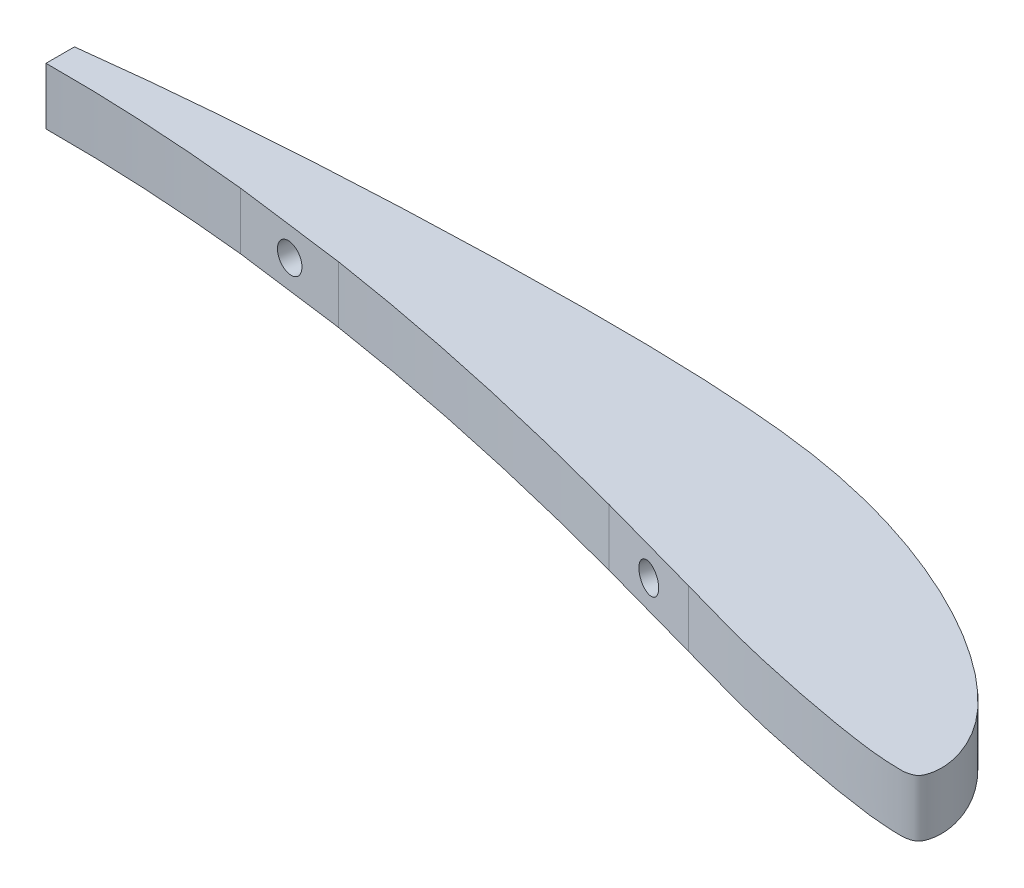
ISO-10303-21;
HEADER;
FILE_DESCRIPTION(('STEP AP214'),'2;1');
FILE_NAME('part.step','',(''),(''),'','','');
FILE_SCHEMA(('AUTOMOTIVE_DESIGN { 1 0 10303 214 1 1 1 1 }'));
ENDSEC;
DATA;
#1=APPLICATION_CONTEXT('core data for automotive mechanical design processes');
#2=APPLICATION_PROTOCOL_DEFINITION('international standard','automotive_design',2000,#1);
#3=PRODUCT_CONTEXT('',#1,'mechanical');
#4=PRODUCT('Part','Part','',(#3));
#5=PRODUCT_RELATED_PRODUCT_CATEGORY('part','',(#4));
#6=PRODUCT_DEFINITION_FORMATION('','',#4);
#7=PRODUCT_DEFINITION_CONTEXT('part definition',#1,'design');
#8=PRODUCT_DEFINITION('design','',#6,#7);
#9=PRODUCT_DEFINITION_SHAPE('','',#8);
#10=(LENGTH_UNIT() NAMED_UNIT(*) SI_UNIT(.MILLI.,.METRE.));
#11=(NAMED_UNIT(*) PLANE_ANGLE_UNIT() SI_UNIT($,.RADIAN.));
#12=(NAMED_UNIT(*) SI_UNIT($,.STERADIAN.) SOLID_ANGLE_UNIT());
#13=UNCERTAINTY_MEASURE_WITH_UNIT(LENGTH_MEASURE(1.E-05),#10,'distance_accuracy_value','');
#14=(GEOMETRIC_REPRESENTATION_CONTEXT(3) GLOBAL_UNCERTAINTY_ASSIGNED_CONTEXT((#13)) GLOBAL_UNIT_ASSIGNED_CONTEXT((#10,
#11,#12)) REPRESENTATION_CONTEXT('',''));
#15=CARTESIAN_POINT('',(0.,0.,0.));
#16=DIRECTION('',(0.,0.,1.));
#17=DIRECTION('',(1.,0.,0.));
#18=AXIS2_PLACEMENT_3D('',#15,#16,#17);
#19=CARTESIAN_POINT('',(-745.964774994291,6.35,0.));
#20=DIRECTION('',(-1.,0.,0.));
#21=DIRECTION('',(0.,0.,1.));
#22=AXIS2_PLACEMENT_3D('',#19,#20,#21);
#23=PLANE('',#22);
#24=DIRECTION('',(0.,0.,-1.));
#25=VECTOR('',#24,1.);
#26=CARTESIAN_POINT('',(-745.964774994291,-6.35,0.));
#27=LINE('',#26,#25);
#28=CARTESIAN_POINT('',(-745.964774994291,-6.35,894.328945770832));
#29=VERTEX_POINT('',#28);
#30=CARTESIAN_POINT('',(-745.964774994291,-6.35,887.978945770832));
#31=VERTEX_POINT('',#30);
#32=EDGE_CURVE('E279',#29,#31,#27,.T.);
#33=ORIENTED_EDGE('',*,*,#32,.F.);
#34=DIRECTION('',(0.,-1.,0.));
#35=VECTOR('',#34,1.);
#36=CARTESIAN_POINT('',(-745.964774994291,6.35,894.328945770832));
#37=LINE('',#36,#35);
#38=CARTESIAN_POINT('',(-745.964774994291,6.35,894.328945770832));
#39=VERTEX_POINT('',#38);
#40=EDGE_CURVE('E11',#39,#29,#37,.T.);
#41=ORIENTED_EDGE('',*,*,#40,.F.);
#42=DIRECTION('',(0.,0.,-1.));
#43=VECTOR('',#42,1.);
#44=CARTESIAN_POINT('',(-745.964774994291,6.35,0.));
#45=LINE('',#44,#43);
#46=CARTESIAN_POINT('',(-745.964774994291,6.35,887.978945770832));
#47=VERTEX_POINT('',#46);
#48=EDGE_CURVE('E140',#39,#47,#45,.T.);
#49=ORIENTED_EDGE('',*,*,#48,.T.);
#50=DIRECTION('',(0.,-1.,0.));
#51=VECTOR('',#50,1.);
#52=CARTESIAN_POINT('',(-745.964774994291,6.35,887.978945770832));
#53=LINE('',#52,#51);
#54=EDGE_CURVE('E91',#47,#31,#53,.T.);
#55=ORIENTED_EDGE('',*,*,#54,.T.);
#56=EDGE_LOOP('',(#33,#41,#49,#55));
#57=FACE_BOUND('',#56,.T.);
#58=ADVANCED_FACE('F41',(#57),#23,.T.);
#59=CARTESIAN_POINT('',(-808.699340930954,6.35,905.288276438396));
#60=CARTESIAN_POINT('',(-808.698191857178,6.35,905.296198372319));
#61=CARTESIAN_POINT('',(-807.475168535791,6.35,904.612954842182));
#62=CARTESIAN_POINT('',(-806.127033424416,6.35,903.950113964455));
#63=CARTESIAN_POINT('',(-802.618982801805,6.35,902.239395629105));
#64=CARTESIAN_POINT('',(-797.908770633153,6.35,900.469078718772));
#65=CARTESIAN_POINT('',(-791.365223913977,6.35,898.656269746206));
#66=CARTESIAN_POINT('',(-783.428383357225,6.35,897.115111010994));
#67=CARTESIAN_POINT('',(-774.188924733392,6.35,895.833621875964));
#68=CARTESIAN_POINT('',(-763.822767503538,6.35,894.900147269464));
#69=CARTESIAN_POINT('',(-752.454908031272,6.35,894.365311487662));
#70=CARTESIAN_POINT('',(-740.235462609927,6.35,894.260295970912));
#71=CARTESIAN_POINT('',(-727.312590057803,6.35,894.617094053665));
#72=CARTESIAN_POINT('',(-713.841744494242,6.35,895.432085538653));
#73=CARTESIAN_POINT('',(-699.977546281879,6.35,896.700198024576));
#74=CARTESIAN_POINT('',(-685.874377769709,6.35,898.403904226764));
#75=CARTESIAN_POINT('',(-671.683433076153,6.35,900.5040600539));
#76=CARTESIAN_POINT('',(-657.55079679191,6.35,902.953772352294));
#77=CARTESIAN_POINT('',(-643.616607747686,6.35,905.709113801342));
#78=CARTESIAN_POINT('',(-630.007767989694,6.35,908.689841220301));
#79=CARTESIAN_POINT('',(-616.843534103814,6.35,911.833301283403));
#80=CARTESIAN_POINT('',(-604.23250930294,6.35,915.056798443748));
#81=CARTESIAN_POINT('',(-592.267820656821,6.35,918.281273148751));
#82=CARTESIAN_POINT('',(-581.031641475759,6.35,921.417682371066));
#83=CARTESIAN_POINT('',(-570.587974662916,6.35,924.370907439865));
#84=CARTESIAN_POINT('',(-560.984262009927,6.35,927.085132383365));
#85=CARTESIAN_POINT('',(-552.153134358304,6.35,929.351793485921));
#86=CARTESIAN_POINT('',(-544.047010511215,6.35,931.129332229515));
#87=CARTESIAN_POINT('',(-536.686335580171,6.35,932.606040356279));
#88=CARTESIAN_POINT('',(-530.108904544209,6.35,933.796548076851));
#89=CARTESIAN_POINT('',(-524.381359639331,6.35,934.681063632716));
#90=CARTESIAN_POINT('',(-519.572677977109,6.35,935.309823737263));
#91=CARTESIAN_POINT('',(-515.722704658943,6.35,935.509297913111));
#92=CARTESIAN_POINT('',(-512.904850762729,6.35,935.614509438357));
#93=CARTESIAN_POINT('',(-510.731548466341,6.35,934.80357871422));
#94=CARTESIAN_POINT('',(-509.995877917624,6.35,932.852574872877));
#95=CARTESIAN_POINT('',(-509.710588794092,6.35,930.680317225795));
#96=CARTESIAN_POINT('',(-509.979483139819,6.35,928.059090990653));
#97=CARTESIAN_POINT('',(-510.771882292447,6.35,925.175527305722));
#98=CARTESIAN_POINT('',(-512.131708870413,6.35,922.092676733402));
#99=CARTESIAN_POINT('',(-514.05615703889,6.35,918.877948489114));
#100=CARTESIAN_POINT('',(-516.642060662247,6.35,915.616901185906));
#101=CARTESIAN_POINT('',(-519.878140770943,6.35,912.33680698191));
#102=CARTESIAN_POINT('',(-523.71087800143,6.35,909.00960317164));
#103=CARTESIAN_POINT('',(-528.144071181997,6.35,905.698403477286));
#104=CARTESIAN_POINT('',(-533.151760778689,6.35,902.445104766043));
#105=CARTESIAN_POINT('',(-538.708148379875,6.35,899.283988977106));
#106=CARTESIAN_POINT('',(-544.799372854643,6.35,896.270613220281));
#107=CARTESIAN_POINT('',(-551.387398728674,6.35,893.42159270246));
#108=CARTESIAN_POINT('',(-558.447971928289,6.35,890.792240248777));
#109=CARTESIAN_POINT('',(-565.953566419515,6.35,888.420626997395));
#110=CARTESIAN_POINT('',(-573.904555797038,6.35,886.40196354502));
#111=CARTESIAN_POINT('',(-582.302577431605,6.35,884.732531082563));
#112=CARTESIAN_POINT('',(-591.189649692332,6.35,883.495409148244));
#113=CARTESIAN_POINT('',(-600.56600959241,6.35,882.653332524039));
#114=CARTESIAN_POINT('',(-610.398787900595,6.35,882.031392964846));
#115=CARTESIAN_POINT('',(-620.641966712539,6.35,881.682741386434));
#116=CARTESIAN_POINT('',(-631.233440040302,6.35,881.550564488751));
#117=CARTESIAN_POINT('',(-642.10944098066,6.35,881.598155150758));
#118=CARTESIAN_POINT('',(-653.189236878864,6.35,881.776525136796));
#119=CARTESIAN_POINT('',(-664.381516727969,6.35,882.072222380966));
#120=CARTESIAN_POINT('',(-675.591761469604,6.35,882.461412521099));
#121=CARTESIAN_POINT('',(-686.732134704751,6.35,882.961422294552));
#122=CARTESIAN_POINT('',(-697.722460944845,6.35,883.574531849831));
#123=CARTESIAN_POINT('',(-708.49209940602,6.35,884.294448937404));
#124=CARTESIAN_POINT('',(-718.972610172344,6.35,885.130375886253));
#125=CARTESIAN_POINT('',(-729.102517035557,6.35,886.065145308932));
#126=CARTESIAN_POINT('',(-738.818795329112,6.35,887.101652587971));
#127=CARTESIAN_POINT('',(-748.063605468283,6.35,888.221764068848));
#128=CARTESIAN_POINT('',(-756.780655187676,6.35,889.420485483526));
#129=CARTESIAN_POINT('',(-764.917940325975,6.35,890.690116784721));
#130=CARTESIAN_POINT('',(-772.428550034332,6.35,892.020421944594));
#131=CARTESIAN_POINT('',(-779.27038565612,6.35,893.396845324595));
#132=CARTESIAN_POINT('',(-785.405289419975,6.35,894.813453468347));
#133=CARTESIAN_POINT('',(-790.800823784972,6.35,896.256131848235));
#134=CARTESIAN_POINT('',(-795.431420104736,6.35,897.713595662658));
#135=CARTESIAN_POINT('',(-799.288024283011,6.35,899.160721449419));
#136=CARTESIAN_POINT('',(-802.424531012396,6.35,900.727430700965));
#137=CARTESIAN_POINT('',(-804.758963598242,6.35,902.349229215227));
#138=CARTESIAN_POINT('',(-806.752273021045,6.35,903.891274172012));
#139=CARTESIAN_POINT('',(-807.654210805784,6.35,904.634120713898));
#140=CARTESIAN_POINT('',(-808.700467109619,6.35,905.280512347734));
#141=CARTESIAN_POINT('',(-808.699340930954,6.35,905.288276438396));
#142=B_SPLINE_CURVE_WITH_KNOTS('',3,(#59,#60,#61,#62,#63,#64,#65,#66,#67,#68,#69,#70,#71,#72,
#73,#74,#75,#76,#77,#78,#79,#80,#81,#82,#83,#84,#85,#86,#87,#88,#89,#90,#91,#92,#93,#94,#95,#96,
#97,#98,#99,#100,#101,#102,#103,#104,#105,#106,#107,#108,#109,#110,#111,#112,#113,#114,#115,
#116,#117,#118,#119,#120,#121,#122,#123,#124,#125,#126,#127,#128,#129,#130,#131,#132,#133,#134,
#135,#136,#137,#138,#139,#140,#141),.UNSPECIFIED.,.T.,.F.,(4,1,1,1,1,1,1,1,1,1,1,1,1,1,1,1,1,1,
1,1,1,1,1,1,1,1,1,1,1,1,1,1,1,1,1,1,1,1,1,1,1,1,1,1,1,1,1,1,1,1,1,1,1,1,1,1,1,1,1,1,1,1,1,1,1,1,
1,1,1,1,1,1,1,1,1,1,1,1,1,1,4),(0.,0.000999594313299212,0.00414743475003776,0.00974820897402395,
0.0180443769200241,0.0288641783652488,0.0418307896412056,0.0567138069576779,0.0733412324180671,
0.0915079886594422,0.111021837040934,0.131661709492213,0.153207715119588,0.175433402170293,
0.198110317315045,0.221011446315139,0.243905882495844,0.266573311035611,0.288810349135398,
0.310405035997316,0.331177743204304,0.350943876391454,0.369556399670184,0.386864963345299,
0.402753039208367,0.417195875784384,0.430379518903367,0.442362633174289,0.453032155511853,
0.462284345612072,0.470026206002306,0.476176644820514,0.480649947409099,0.483553073373249,
0.486420689318958,0.489953231463337,0.494096926743959,0.498850588304447,0.504196750280792,
0.510125492183598,0.516691031253851,0.524011699263473,0.532092122465354,0.540897920896839,
0.550403413935838,0.56058104089174,0.571396483088815,0.582828080950064,0.594829641292505,
0.607347037120814,0.620384325080165,0.633968936607918,0.648199967415963,0.663193936825189,
0.678898580785939,0.695226562400326,0.712113220733955,0.729459406270428,0.747143116877991,
0.765009771536014,0.782904928287736,0.800688045055655,0.818242104849469,0.835449083117584,
0.852211620697039,0.868429578359411,0.884009362888173,0.898854951230209,0.912881826809319,
0.926010749515415,0.938166770937821,0.949289699209522,0.959322171916738,0.968216949447241,
0.975948220006129,0.982474409223121,0.987904722814407,0.992516501480522,0.996351137832237,
0.999020322442866,1.),.UNSPECIFIED.);
#143=DIRECTION('',(0.,-1.,0.));
#144=VECTOR('',#143,1.);
#145=SURFACE_OF_LINEAR_EXTRUSION('',#142,#144);
#146=CARTESIAN_POINT('',(-745.964774994291,-6.35,894.328945770832));
#147=CARTESIAN_POINT('',(-744.133904200339,-6.35,894.315721527457));
#148=CARTESIAN_POINT('',(-737.978827427177,-6.35,894.32260124425));
#149=CARTESIAN_POINT('',(-727.312590057803,-6.35,894.617094053665));
#150=CARTESIAN_POINT('',(-713.845005557512,-6.35,895.431888243036));
#151=CARTESIAN_POINT('',(-704.715487742827,-6.35,896.266834180997));
#152=CARTESIAN_POINT('',(-700.088539907113,-6.35,896.757033353814));
#153=B_SPLINE_CURVE_WITH_KNOTS('',3,(#146,#147,#148,#149,#150,#151,#152),.UNSPECIFIED.,.F.,.F.,
(4,1,1,1,4),(0.102282201044065,0.111021837040934,0.131661709492213,0.153207715119588,
0.175417809222681),.UNSPECIFIED.);
#154=CARTESIAN_POINT('',(-700.088539907113,-6.35,896.757033353814));
#155=VERTEX_POINT('',#154);
#156=EDGE_CURVE('E242',#29,#155,#153,.T.);
#157=ORIENTED_EDGE('',*,*,#156,.T.);
#158=DIRECTION('',(0.,-1.,0.));
#159=VECTOR('',#158,1.);
#160=CARTESIAN_POINT('',(-700.088539907113,6.35,896.757033353814));
#161=LINE('',#160,#159);
#162=CARTESIAN_POINT('',(-700.088539907113,6.35,896.757033353814));
#163=VERTEX_POINT('',#162);
#164=EDGE_CURVE('E52',#163,#155,#161,.T.);
#165=ORIENTED_EDGE('',*,*,#164,.F.);
#166=CARTESIAN_POINT('',(-700.088539907113,6.35,896.757033353814));
#167=CARTESIAN_POINT('',(-704.715487742827,6.35,896.266834180997));
#168=CARTESIAN_POINT('',(-713.845005557512,6.35,895.431888243036));
#169=CARTESIAN_POINT('',(-727.312590057803,6.35,894.617094053665));
#170=CARTESIAN_POINT('',(-737.978827427177,6.35,894.32260124425));
#171=CARTESIAN_POINT('',(-744.133904200339,6.35,894.315721527457));
#172=CARTESIAN_POINT('',(-745.964774994291,6.35,894.328945770832));
#173=B_SPLINE_CURVE_WITH_KNOTS('',3,(#166,#167,#168,#169,#170,#171,#172),.UNSPECIFIED.,.F.,.F.,
(4,1,1,1,4),(0.102282201044065,0.124492295147158,0.146038300774533,0.166678173225812,
0.175417809222681),.UNSPECIFIED.);
#174=EDGE_CURVE('E142',#39,#163,#173,.F.);
#175=ORIENTED_EDGE('',*,*,#174,.F.);
#176=ORIENTED_EDGE('',*,*,#40,.T.);
#177=EDGE_LOOP('',(#157,#165,#175,#176));
#178=FACE_BOUND('',#177,.T.);
#179=ADVANCED_FACE('F163',(#178),#145,.F.);
#180=CARTESIAN_POINT('',(-127.295549227988,6.35,971.78781403398));
#181=DIRECTION('',(-0.129881536724028,0.,0.991529518682225));
#182=DIRECTION('',(0.991529518682225,0.,0.129881536724028));
#183=AXIS2_PLACEMENT_3D('',#180,#181,#182);
#184=PLANE('',#183);
#185=CARTESIAN_POINT('',(-687.496115019849,0.,898.40652887021));
#186=DIRECTION('',(-0.129881536724028,0.,0.991529518682225));
#187=DIRECTION('',(0.991529518682225,0.,0.129881536724028));
#188=AXIS2_PLACEMENT_3D('',#185,#186,#187);
#189=CIRCLE('',#188,3.17499999999999);
#190=CARTESIAN_POINT('',(-684.348008798032,0.,898.818902749308));
#191=VERTEX_POINT('',#190);
#192=EDGE_CURVE('E282',#191,#191,#189,.T.);
#193=ORIENTED_EDGE('',*,*,#192,.F.);
#194=EDGE_LOOP('',(#193));
#195=FACE_BOUND('',#194,.T.);
#196=DIRECTION('',(-0.991529518682225,0.,-0.129881536724028));
#197=VECTOR('',#196,1.);
#198=CARTESIAN_POINT('',(-127.295549227988,-6.35,971.78781403398));
#199=LINE('',#198,#197);
#200=CARTESIAN_POINT('',(-674.903690132584,-6.35,900.056024386604));
#201=VERTEX_POINT('',#200);
#202=EDGE_CURVE('E235',#201,#155,#199,.T.);
#203=ORIENTED_EDGE('',*,*,#202,.F.);
#204=DIRECTION('',(0.,-1.,0.));
#205=VECTOR('',#204,1.);
#206=CARTESIAN_POINT('',(-674.903690132584,6.35,900.056024386604));
#207=LINE('',#206,#205);
#208=CARTESIAN_POINT('',(-674.903690132584,6.35,900.056024386604));
#209=VERTEX_POINT('',#208);
#210=EDGE_CURVE('E127',#209,#201,#207,.T.);
#211=ORIENTED_EDGE('',*,*,#210,.F.);
#212=DIRECTION('',(-0.991529518682225,0.,-0.129881536724028));
#213=VECTOR('',#212,1.);
#214=CARTESIAN_POINT('',(-127.295549227988,6.35,971.78781403398));
#215=LINE('',#214,#213);
#216=EDGE_CURVE('E113',#209,#163,#215,.T.);
#217=ORIENTED_EDGE('',*,*,#216,.T.);
#218=ORIENTED_EDGE('',*,*,#164,.T.);
#219=EDGE_LOOP('',(#203,#211,#217,#218));
#220=FACE_BOUND('',#219,.T.);
#221=ADVANCED_FACE('F316',(#195,#220),#184,.T.);
#222=CARTESIAN_POINT('',(-674.903690132584,-6.35,900.056024386604));
#223=CARTESIAN_POINT('',(-673.832475338733,-6.35,900.221916955802));
#224=CARTESIAN_POINT('',(-668.024145960953,-6.35,901.138350816725));
#225=CARTESIAN_POINT('',(-657.55079679191,-6.35,902.953772352294));
#226=CARTESIAN_POINT('',(-643.616607747686,-6.35,905.709113801342));
#227=CARTESIAN_POINT('',(-630.007767989694,-6.35,908.689841220301));
#228=CARTESIAN_POINT('',(-616.843534103814,-6.35,911.833301283403));
#229=CARTESIAN_POINT('',(-606.152562090681,-6.35,914.566014799538));
#230=CARTESIAN_POINT('',(-599.861126075847,-6.35,916.241106363395));
#231=CARTESIAN_POINT('',(-597.776391121279,-6.35,916.80250156136));
#232=B_SPLINE_CURVE_WITH_KNOTS('',3,(#222,#223,#224,#225,#226,#227,#228,#229,#230,#231),
.UNSPECIFIED.,.F.,.F.,(4,1,1,1,1,1,1,4),(0.215837070183439,0.221011446315139,0.243905882495844,
0.266573311035611,0.288810349135398,0.310405035997316,0.331177743204304,0.3414839273307),.UNSPECIFIED.);
#233=CARTESIAN_POINT('',(-597.776391121279,-6.35,916.80250156136));
#234=VERTEX_POINT('',#233);
#235=EDGE_CURVE('E122',#201,#234,#232,.T.);
#236=ORIENTED_EDGE('',*,*,#235,.T.);
#237=DIRECTION('',(0.,-1.,0.));
#238=VECTOR('',#237,1.);
#239=CARTESIAN_POINT('',(-597.776391121279,6.35,916.80250156136));
#240=LINE('',#239,#238);
#241=CARTESIAN_POINT('',(-597.776391121279,6.35,916.80250156136));
#242=VERTEX_POINT('',#241);
#243=EDGE_CURVE('E119',#242,#234,#240,.T.);
#244=ORIENTED_EDGE('',*,*,#243,.F.);
#245=CARTESIAN_POINT('',(-597.776391121279,6.35,916.80250156136));
#246=CARTESIAN_POINT('',(-599.861126075847,6.35,916.241106363395));
#247=CARTESIAN_POINT('',(-606.152562090681,6.35,914.566014799538));
#248=CARTESIAN_POINT('',(-616.843534103814,6.35,911.833301283403));
#249=CARTESIAN_POINT('',(-630.007767989694,6.35,908.689841220301));
#250=CARTESIAN_POINT('',(-643.616607747686,6.35,905.709113801342));
#251=CARTESIAN_POINT('',(-657.55079679191,6.35,902.953772352294));
#252=CARTESIAN_POINT('',(-668.024145960953,6.35,901.138350816725));
#253=CARTESIAN_POINT('',(-673.832475338733,6.35,900.221916955802));
#254=CARTESIAN_POINT('',(-674.903690132584,6.35,900.056024386604));
#255=B_SPLINE_CURVE_WITH_KNOTS('',3,(#245,#246,#247,#248,#249,#250,#251,#252,#253,#254),
.UNSPECIFIED.,.F.,.F.,(4,1,1,1,1,1,1,4),(0.215837070183439,0.226143254309835,0.246915961516823,
0.268510648378741,0.290747686478528,0.313415115018295,0.336309551199,0.3414839273307),.UNSPECIFIED.);
#256=EDGE_CURVE('E106',#209,#242,#255,.F.);
#257=ORIENTED_EDGE('',*,*,#256,.F.);
#258=ORIENTED_EDGE('',*,*,#210,.T.);
#259=EDGE_LOOP('',(#236,#244,#257,#258));
#260=FACE_BOUND('',#259,.T.);
#261=ADVANCED_FACE('F120',(#260),#145,.F.);
#262=CARTESIAN_POINT('',(-279.350563823569,6.35,1005.28710825817));
#263=DIRECTION('',(-0.267736527501418,0.,0.963492164909234));
#264=DIRECTION('',(0.963492164909234,0.,0.267736527501418));
#265=AXIS2_PLACEMENT_3D('',#262,#263,#264);
#266=PLANE('',#265);
#267=CARTESIAN_POINT('',(-585.540040626931,0.,920.202755460628));
#268=DIRECTION('',(-0.267736527501418,0.,0.963492164909234));
#269=DIRECTION('',(0.963492164909234,0.,0.267736527501418));
#270=AXIS2_PLACEMENT_3D('',#267,#268,#269);
#271=CIRCLE('',#270,3.17499999999999);
#272=CARTESIAN_POINT('',(-582.480953003345,0.,921.052818935445));
#273=VERTEX_POINT('',#272);
#274=EDGE_CURVE('E302',#273,#273,#271,.T.);
#275=ORIENTED_EDGE('',*,*,#274,.F.);
#276=EDGE_LOOP('',(#275));
#277=FACE_BOUND('',#276,.T.);
#278=DIRECTION('',(-0.963492164909234,0.,-0.267736527501418));
#279=VECTOR('',#278,1.);
#280=CARTESIAN_POINT('',(-279.350563823569,-6.35,1005.28710825817));
#281=LINE('',#280,#279);
#282=CARTESIAN_POINT('',(-573.303690132584,-6.35,923.603009359896));
#283=VERTEX_POINT('',#282);
#284=EDGE_CURVE('E287',#283,#234,#281,.T.);
#285=ORIENTED_EDGE('',*,*,#284,.F.);
#286=DIRECTION('',(0.,-1.,0.));
#287=VECTOR('',#286,1.);
#288=CARTESIAN_POINT('',(-573.303690132584,6.35,923.603009359896));
#289=LINE('',#288,#287);
#290=CARTESIAN_POINT('',(-573.303690132584,6.35,923.603009359896));
#291=VERTEX_POINT('',#290);
#292=EDGE_CURVE('E84',#291,#283,#289,.T.);
#293=ORIENTED_EDGE('',*,*,#292,.F.);
#294=DIRECTION('',(-0.963492164909234,0.,-0.267736527501418));
#295=VECTOR('',#294,1.);
#296=CARTESIAN_POINT('',(-279.350563823569,6.35,1005.28710825817));
#297=LINE('',#296,#295);
#298=EDGE_CURVE('E111',#291,#242,#297,.T.);
#299=ORIENTED_EDGE('',*,*,#298,.T.);
#300=ORIENTED_EDGE('',*,*,#243,.T.);
#301=EDGE_LOOP('',(#285,#293,#299,#300));
#302=FACE_BOUND('',#301,.T.);
#303=ADVANCED_FACE('F129',(#277,#302),#266,.T.);
#304=CARTESIAN_POINT('',(-573.303690132584,-6.35,923.603009359896));
#305=CARTESIAN_POINT('',(-572.302950395517,-6.35,923.885809681457));
#306=CARTESIAN_POINT('',(-568.099460895047,-6.35,925.07421733522));
#307=CARTESIAN_POINT('',(-560.984262009927,-6.35,927.085132383365));
#308=CARTESIAN_POINT('',(-552.153134358304,-6.35,929.351793485921));
#309=CARTESIAN_POINT('',(-544.047010511215,-6.35,931.129332229515));
#310=CARTESIAN_POINT('',(-536.686335580171,-6.35,932.606040356279));
#311=CARTESIAN_POINT('',(-530.108904544209,-6.35,933.796548076851));
#312=CARTESIAN_POINT('',(-524.381359639331,-6.35,934.681063632716));
#313=CARTESIAN_POINT('',(-519.572677977109,-6.35,935.309823737263));
#314=CARTESIAN_POINT('',(-515.722704658943,-6.35,935.509297913111));
#315=CARTESIAN_POINT('',(-512.904850762729,-6.35,935.614509438357));
#316=CARTESIAN_POINT('',(-510.731548466341,-6.35,934.80357871422));
#317=CARTESIAN_POINT('',(-509.995877917624,-6.35,932.852574872877));
#318=CARTESIAN_POINT('',(-509.710588794092,-6.35,930.680317225795));
#319=CARTESIAN_POINT('',(-509.979483139819,-6.35,928.059090990653));
#320=CARTESIAN_POINT('',(-510.771882292447,-6.35,925.175527305722));
#321=CARTESIAN_POINT('',(-512.131708870413,-6.35,922.092676733402));
#322=CARTESIAN_POINT('',(-514.05615703889,-6.35,918.877948489114));
#323=CARTESIAN_POINT('',(-516.642060662247,-6.35,915.616901185906));
#324=CARTESIAN_POINT('',(-519.878140770943,-6.35,912.33680698191));
#325=CARTESIAN_POINT('',(-523.71087800143,-6.35,909.00960317164));
#326=CARTESIAN_POINT('',(-528.144071181997,-6.35,905.698403477286));
#327=CARTESIAN_POINT('',(-533.151760778689,-6.35,902.445104766043));
#328=CARTESIAN_POINT('',(-538.708148379875,-6.35,899.283988977106));
#329=CARTESIAN_POINT('',(-544.799372854643,-6.35,896.270613220281));
#330=CARTESIAN_POINT('',(-551.387398728674,-6.35,893.42159270246));
#331=CARTESIAN_POINT('',(-558.447971928289,-6.35,890.792240248777));
#332=CARTESIAN_POINT('',(-565.953566419515,-6.35,888.420626997395));
#333=CARTESIAN_POINT('',(-573.904555797038,-6.35,886.40196354502));
#334=CARTESIAN_POINT('',(-582.302577431605,-6.35,884.732531082563));
#335=CARTESIAN_POINT('',(-591.189649692332,-6.35,883.495409148244));
#336=CARTESIAN_POINT('',(-600.56600959241,-6.35,882.653332524039));
#337=CARTESIAN_POINT('',(-610.398787900595,-6.35,882.031392964846));
#338=CARTESIAN_POINT('',(-620.641966712539,-6.35,881.682741386434));
#339=CARTESIAN_POINT('',(-631.233440040302,-6.35,881.550564488751));
#340=CARTESIAN_POINT('',(-642.10944098066,-6.35,881.598155150758));
#341=CARTESIAN_POINT('',(-653.189236878864,-6.35,881.776525136796));
#342=CARTESIAN_POINT('',(-664.381516727969,-6.35,882.072222380966));
#343=CARTESIAN_POINT('',(-675.591761469604,-6.35,882.461412521099));
#344=CARTESIAN_POINT('',(-686.732134704751,-6.35,882.961422294552));
#345=CARTESIAN_POINT('',(-697.722460944845,-6.35,883.574531849831));
#346=CARTESIAN_POINT('',(-708.49209940602,-6.35,884.294448937404));
#347=CARTESIAN_POINT('',(-718.972610172344,-6.35,885.130375886253));
#348=CARTESIAN_POINT('',(-729.102517035557,-6.35,886.065145308932));
#349=CARTESIAN_POINT('',(-738.061681725226,-6.35,887.020885679307));
#350=CARTESIAN_POINT('',(-743.634498034994,-6.35,887.686438438243));
#351=CARTESIAN_POINT('',(-745.964774994291,-6.35,887.978945770832));
#352=B_SPLINE_CURVE_WITH_KNOTS('',3,(#304,#305,#306,#307,#308,#309,#310,#311,#312,#313,#314,
#315,#316,#317,#318,#319,#320,#321,#322,#323,#324,#325,#326,#327,#328,#329,#330,#331,#332,#333,
#334,#335,#336,#337,#338,#339,#340,#341,#342,#343,#344,#345,#346,#347,#348,#349,#350,#351),
.UNSPECIFIED.,.F.,.F.,(4,1,1,1,1,1,1,1,1,1,1,1,1,1,1,1,1,1,1,1,1,1,1,1,1,1,1,1,1,1,1,1,1,1,1,1,
1,1,1,1,1,1,1,1,1,4),(0.381900739457082,0.386864963345299,0.402753039208367,0.417195875784384,
0.430379518903367,0.442362633174289,0.453032155511853,0.462284345612072,0.470026206002306,
0.476176644820514,0.480649947409099,0.483553073373249,0.486420689318958,0.489953231463337,
0.494096926743959,0.498850588304447,0.504196750280792,0.510125492183598,0.516691031253851,
0.524011699263473,0.532092122465354,0.540897920896839,0.550403413935838,0.56058104089174,
0.571396483088815,0.582828080950064,0.594829641292505,0.607347037120814,0.620384325080165,
0.633968936607918,0.648199967415963,0.663193936825189,0.678898580785939,0.695226562400326,
0.712113220733955,0.729459406270428,0.747143116877991,0.765009771536014,0.782904928287736,
0.800688045055655,0.818242104849469,0.835449083117584,0.852211620697039,0.868429578359411,
0.884009362888173,0.895220401147318),.UNSPECIFIED.);
#353=EDGE_CURVE('E143',#283,#31,#352,.T.);
#354=ORIENTED_EDGE('',*,*,#353,.T.);
#355=ORIENTED_EDGE('',*,*,#54,.F.);
#356=CARTESIAN_POINT('',(-745.964774994291,6.35,887.978945770832));
#357=CARTESIAN_POINT('',(-743.634498034994,6.35,887.686438438243));
#358=CARTESIAN_POINT('',(-738.061681725226,6.35,887.020885679307));
#359=CARTESIAN_POINT('',(-729.102517035557,6.35,886.065145308932));
#360=CARTESIAN_POINT('',(-718.972610172344,6.35,885.130375886253));
#361=CARTESIAN_POINT('',(-708.49209940602,6.35,884.294448937404));
#362=CARTESIAN_POINT('',(-697.722460944845,6.35,883.574531849831));
#363=CARTESIAN_POINT('',(-686.732134704751,6.35,882.961422294552));
#364=CARTESIAN_POINT('',(-675.591761469604,6.35,882.461412521099));
#365=CARTESIAN_POINT('',(-664.381516727969,6.35,882.072222380966));
#366=CARTESIAN_POINT('',(-653.189236878864,6.35,881.776525136796));
#367=CARTESIAN_POINT('',(-642.10944098066,6.35,881.598155150758));
#368=CARTESIAN_POINT('',(-631.233440040302,6.35,881.550564488751));
#369=CARTESIAN_POINT('',(-620.641966712539,6.35,881.682741386434));
#370=CARTESIAN_POINT('',(-610.398787900595,6.35,882.031392964846));
#371=CARTESIAN_POINT('',(-600.56600959241,6.35,882.653332524039));
#372=CARTESIAN_POINT('',(-591.189649692332,6.35,883.495409148244));
#373=CARTESIAN_POINT('',(-582.302577431605,6.35,884.732531082563));
#374=CARTESIAN_POINT('',(-573.904555797038,6.35,886.40196354502));
#375=CARTESIAN_POINT('',(-565.953566419515,6.35,888.420626997395));
#376=CARTESIAN_POINT('',(-558.447971928289,6.35,890.792240248777));
#377=CARTESIAN_POINT('',(-551.387398728674,6.35,893.42159270246));
#378=CARTESIAN_POINT('',(-544.799372854643,6.35,896.270613220281));
#379=CARTESIAN_POINT('',(-538.708148379875,6.35,899.283988977106));
#380=CARTESIAN_POINT('',(-533.151760778689,6.35,902.445104766043));
#381=CARTESIAN_POINT('',(-528.144071181997,6.35,905.698403477286));
#382=CARTESIAN_POINT('',(-523.71087800143,6.35,909.00960317164));
#383=CARTESIAN_POINT('',(-519.878140770943,6.35,912.33680698191));
#384=CARTESIAN_POINT('',(-516.642060662247,6.35,915.616901185906));
#385=CARTESIAN_POINT('',(-514.05615703889,6.35,918.877948489114));
#386=CARTESIAN_POINT('',(-512.131708870413,6.35,922.092676733402));
#387=CARTESIAN_POINT('',(-510.771882292447,6.35,925.175527305722));
#388=CARTESIAN_POINT('',(-509.979483139819,6.35,928.059090990653));
#389=CARTESIAN_POINT('',(-509.710588794092,6.35,930.680317225795));
#390=CARTESIAN_POINT('',(-509.995877917624,6.35,932.852574872877));
#391=CARTESIAN_POINT('',(-510.731548466341,6.35,934.80357871422));
#392=CARTESIAN_POINT('',(-512.904850762729,6.35,935.614509438357));
#393=CARTESIAN_POINT('',(-515.722704658943,6.35,935.509297913111));
#394=CARTESIAN_POINT('',(-519.572677977109,6.35,935.309823737263));
#395=CARTESIAN_POINT('',(-524.381359639331,6.35,934.681063632716));
#396=CARTESIAN_POINT('',(-530.108904544209,6.35,933.796548076851));
#397=CARTESIAN_POINT('',(-536.686335580171,6.35,932.606040356279));
#398=CARTESIAN_POINT('',(-544.047010511215,6.35,931.129332229515));
#399=CARTESIAN_POINT('',(-552.153134358304,6.35,929.351793485921));
#400=CARTESIAN_POINT('',(-560.984262009927,6.35,927.085132383365));
#401=CARTESIAN_POINT('',(-568.099460895047,6.35,925.07421733522));
#402=CARTESIAN_POINT('',(-572.302950395517,6.35,923.885809681457));
#403=CARTESIAN_POINT('',(-573.303690132584,6.35,923.603009359896));
#404=B_SPLINE_CURVE_WITH_KNOTS('',3,(#356,#357,#358,#359,#360,#361,#362,#363,#364,#365,#366,
#367,#368,#369,#370,#371,#372,#373,#374,#375,#376,#377,#378,#379,#380,#381,#382,#383,#384,#385,
#386,#387,#388,#389,#390,#391,#392,#393,#394,#395,#396,#397,#398,#399,#400,#401,#402,#403),
.UNSPECIFIED.,.F.,.F.,(4,1,1,1,1,1,1,1,1,1,1,1,1,1,1,1,1,1,1,1,1,1,1,1,1,1,1,1,1,1,1,1,1,1,1,1,
1,1,1,1,1,1,1,1,1,4),(0.381900739457082,0.393111777716227,0.40869156224499,0.424909519907361,
0.441672057486816,0.458879035754931,0.476433095548745,0.494216212316665,0.512111369068386,
0.52997802372641,0.547661734333972,0.565007919870445,0.581894578204074,0.598222559818462,
0.613927203779212,0.628921173188438,0.643152203996482,0.656736815524235,0.669774103483587,
0.682291499311896,0.694293059654336,0.705724657515585,0.71654009971266,0.726717726668562,
0.736223219707561,0.745029018139046,0.753109441340928,0.76043010935055,0.766995648420802,
0.772924390323608,0.778270552299953,0.783024213860441,0.787167909141064,0.790700451285443,
0.793568067231152,0.796471193195301,0.800944495783886,0.807094934602094,0.814836794992328,
0.824088985092547,0.834758507430111,0.846741621701034,0.859925264820016,0.874368101396033,
0.890256177259101,0.895220401147318),.UNSPECIFIED.);
#405=EDGE_CURVE('E61',#291,#47,#404,.F.);
#406=ORIENTED_EDGE('',*,*,#405,.F.);
#407=ORIENTED_EDGE('',*,*,#292,.T.);
#408=EDGE_LOOP('',(#354,#355,#406,#407));
#409=FACE_BOUND('',#408,.T.);
#410=ADVANCED_FACE('F153',(#409),#145,.F.);
#411=CARTESIAN_POINT('',(0.,6.35,0.));
#412=DIRECTION('',(0.,1.,0.));
#413=DIRECTION('',(0.,0.,1.));
#414=AXIS2_PLACEMENT_3D('',#411,#412,#413);
#415=PLANE('',#414);
#416=ORIENTED_EDGE('',*,*,#48,.F.);
#417=ORIENTED_EDGE('',*,*,#174,.T.);
#418=ORIENTED_EDGE('',*,*,#216,.F.);
#419=ORIENTED_EDGE('',*,*,#256,.T.);
#420=ORIENTED_EDGE('',*,*,#298,.F.);
#421=ORIENTED_EDGE('',*,*,#405,.T.);
#422=EDGE_LOOP('',(#416,#417,#418,#419,#420,#421));
#423=FACE_BOUND('',#422,.T.);
#424=ADVANCED_FACE('F109',(#423),#415,.T.);
#425=CARTESIAN_POINT('',(0.,-6.35,0.));
#426=DIRECTION('',(0.,1.,0.));
#427=DIRECTION('',(0.,0.,1.));
#428=AXIS2_PLACEMENT_3D('',#425,#426,#427);
#429=PLANE('',#428);
#430=ORIENTED_EDGE('',*,*,#32,.T.);
#431=ORIENTED_EDGE('',*,*,#353,.F.);
#432=ORIENTED_EDGE('',*,*,#284,.T.);
#433=ORIENTED_EDGE('',*,*,#235,.F.);
#434=ORIENTED_EDGE('',*,*,#202,.T.);
#435=ORIENTED_EDGE('',*,*,#156,.F.);
#436=EDGE_LOOP('',(#430,#431,#432,#433,#434,#435));
#437=FACE_BOUND('',#436,.T.);
#438=ADVANCED_FACE('F164',(#437),#429,.F.);
#439=CARTESIAN_POINT('',(-685.846619503453,0.,885.814103982945));
#440=DIRECTION('',(-0.129881536724028,0.,0.991529518682225));
#441=DIRECTION('',(0.991529518682225,0.,0.129881536724028));
#442=AXIS2_PLACEMENT_3D('',#439,#440,#441);
#443=CONICAL_SURFACE('',#442,3.17499999999999,1.02974425867666);
#444=CARTESIAN_POINT('',(-685.598840279187,0.,883.92253092974));
#445=VERTEX_POINT('',#444);
#446=VERTEX_LOOP('',#445);
#447=FACE_BOUND('',#446,.T.);
#448=CARTESIAN_POINT('',(-685.846619503453,0.,885.814103982945));
#449=DIRECTION('',(-0.129881536724028,0.,0.991529518682225));
#450=DIRECTION('',(0.991529518682225,0.,0.129881536724028));
#451=AXIS2_PLACEMENT_3D('',#448,#449,#450);
#452=CIRCLE('',#451,3.17499999999999);
#453=CARTESIAN_POINT('',(-682.698513281637,0.,886.226477862044));
#454=VERTEX_POINT('',#453);
#455=EDGE_CURVE('E174',#454,#454,#452,.T.);
#456=ORIENTED_EDGE('',*,*,#455,.T.);
#457=EDGE_LOOP('',(#456));
#458=FACE_BOUND('',#457,.T.);
#459=ADVANCED_FACE('F191',(#447,#458),#443,.F.);
#460=CARTESIAN_POINT('',(-687.496115019849,0.,898.40652887021));
#461=DIRECTION('',(-0.129881536724028,0.,0.991529518682225));
#462=DIRECTION('',(0.991529518682225,0.,0.129881536724028));
#463=AXIS2_PLACEMENT_3D('',#460,#461,#462);
#464=CYLINDRICAL_SURFACE('',#463,3.17499999999999);
#465=ORIENTED_EDGE('',*,*,#455,.F.);
#466=EDGE_LOOP('',(#465));
#467=FACE_BOUND('',#466,.T.);
#468=ORIENTED_EDGE('',*,*,#192,.T.);
#469=EDGE_LOOP('',(#468));
#470=FACE_BOUND('',#469,.T.);
#471=ADVANCED_FACE('F371',(#467,#470),#464,.F.);
#472=CARTESIAN_POINT('',(-582.139786727663,0.,907.966404966281));
#473=DIRECTION('',(-0.267736527501418,0.,0.963492164909234));
#474=DIRECTION('',(0.963492164909234,0.,0.267736527501418));
#475=AXIS2_PLACEMENT_3D('',#472,#473,#474);
#476=CONICAL_SURFACE('',#475,3.17499999999999,1.02974425867664);
#477=CARTESIAN_POINT('',(-581.629017061972,0.,906.128319683113));
#478=VERTEX_POINT('',#477);
#479=VERTEX_LOOP('',#478);
#480=FACE_BOUND('',#479,.T.);
#481=CARTESIAN_POINT('',(-582.139786727663,0.,907.966404966281));
#482=DIRECTION('',(-0.267736527501418,0.,0.963492164909234));
#483=DIRECTION('',(0.963492164909234,0.,0.267736527501418));
#484=AXIS2_PLACEMENT_3D('',#481,#482,#483);
#485=CIRCLE('',#484,3.17499999999999);
#486=CARTESIAN_POINT('',(-579.080699104077,0.,908.816468441098));
#487=VERTEX_POINT('',#486);
#488=EDGE_CURVE('E298',#487,#487,#485,.T.);
#489=ORIENTED_EDGE('',*,*,#488,.T.);
#490=EDGE_LOOP('',(#489));
#491=FACE_BOUND('',#490,.T.);
#492=ADVANCED_FACE('F379',(#480,#491),#476,.F.);
#493=CARTESIAN_POINT('',(-585.540040626931,0.,920.202755460628));
#494=DIRECTION('',(-0.267736527501418,0.,0.963492164909234));
#495=DIRECTION('',(0.963492164909234,0.,0.267736527501418));
#496=AXIS2_PLACEMENT_3D('',#493,#494,#495);
#497=CYLINDRICAL_SURFACE('',#496,3.17499999999999);
#498=ORIENTED_EDGE('',*,*,#488,.F.);
#499=EDGE_LOOP('',(#498));
#500=FACE_BOUND('',#499,.T.);
#501=ORIENTED_EDGE('',*,*,#274,.T.);
#502=EDGE_LOOP('',(#501));
#503=FACE_BOUND('',#502,.T.);
#504=ADVANCED_FACE('F308',(#500,#503),#497,.F.);
#505=CLOSED_SHELL('',(#58,#179,#221,#261,#303,#410,#424,#438,#459,#471,#492,#504));
#506=MANIFOLD_SOLID_BREP('B2',#505);
#507=ADVANCED_BREP_SHAPE_REPRESENTATION('',(#18,#506),#14);
#508=SHAPE_DEFINITION_REPRESENTATION(#9,#507);
ENDSEC;
END-ISO-10303-21;
